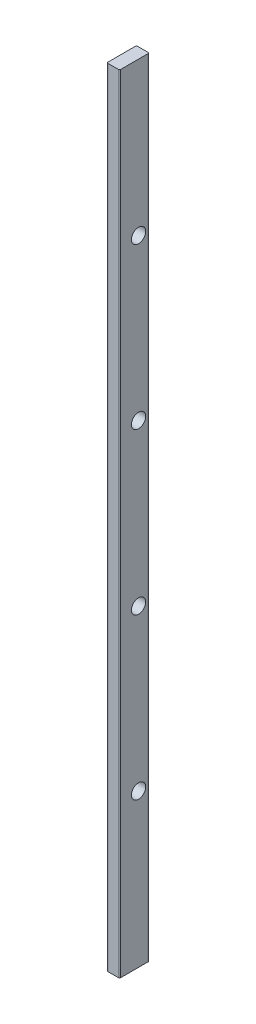
ISO-10303-21;
HEADER;
FILE_DESCRIPTION(('STEP AP214'),'2;1');
FILE_NAME('part.step','',(''),(''),'','','');
FILE_SCHEMA(('AUTOMOTIVE_DESIGN { 1 0 10303 214 1 1 1 1 }'));
ENDSEC;
DATA;
#1=APPLICATION_CONTEXT('core data for automotive mechanical design processes');
#2=APPLICATION_PROTOCOL_DEFINITION('international standard','automotive_design',2000,#1);
#3=PRODUCT_CONTEXT('',#1,'mechanical');
#4=PRODUCT('Part','Part','',(#3));
#5=PRODUCT_RELATED_PRODUCT_CATEGORY('part','',(#4));
#6=PRODUCT_DEFINITION_FORMATION('','',#4);
#7=PRODUCT_DEFINITION_CONTEXT('part definition',#1,'design');
#8=PRODUCT_DEFINITION('design','',#6,#7);
#9=PRODUCT_DEFINITION_SHAPE('','',#8);
#10=(LENGTH_UNIT() NAMED_UNIT(*) SI_UNIT(.MILLI.,.METRE.));
#11=(NAMED_UNIT(*) PLANE_ANGLE_UNIT() SI_UNIT($,.RADIAN.));
#12=(NAMED_UNIT(*) SI_UNIT($,.STERADIAN.) SOLID_ANGLE_UNIT());
#13=UNCERTAINTY_MEASURE_WITH_UNIT(LENGTH_MEASURE(1.E-05),#10,'distance_accuracy_value','');
#14=(GEOMETRIC_REPRESENTATION_CONTEXT(3) GLOBAL_UNCERTAINTY_ASSIGNED_CONTEXT((#13)) GLOBAL_UNIT_ASSIGNED_CONTEXT((#10,
#11,#12)) REPRESENTATION_CONTEXT('',''));
#15=CARTESIAN_POINT('',(0.,0.,0.));
#16=DIRECTION('',(0.,0.,1.));
#17=DIRECTION('',(1.,0.,0.));
#18=AXIS2_PLACEMENT_3D('',#15,#16,#17);
#19=CARTESIAN_POINT('',(19.05,2362.2,44.45));
#20=DIRECTION('',(-1.,0.,0.));
#21=DIRECTION('',(0.,0.,1.));
#22=AXIS2_PLACEMENT_3D('',#19,#20,#21);
#23=PLANE('',#22);
#24=CARTESIAN_POINT('',(19.0500000000006,1903.4125,-12.7));
#25=DIRECTION('',(-1.,0.,0.));
#26=DIRECTION('',(0.,0.,-1.));
#27=AXIS2_PLACEMENT_3D('',#24,#25,#26);
#28=CIRCLE('',#27,21.43125);
#29=CARTESIAN_POINT('',(19.0500000000006,1903.4125,-34.13125));
#30=VERTEX_POINT('',#29);
#31=EDGE_CURVE('E182',#30,#30,#28,.T.);
#32=ORIENTED_EDGE('',*,*,#31,.T.);
#33=EDGE_LOOP('',(#32));
#34=FACE_BOUND('',#33,.T.);
#35=CARTESIAN_POINT('',(19.0500000000013,1422.4,-12.7));
#36=DIRECTION('',(-1.,0.,0.));
#37=DIRECTION('',(0.,0.,-1.));
#38=AXIS2_PLACEMENT_3D('',#35,#36,#37);
#39=CIRCLE('',#38,21.43125);
#40=CARTESIAN_POINT('',(19.0500000000013,1422.4,-34.13125));
#41=VERTEX_POINT('',#40);
#42=EDGE_CURVE('E190',#41,#41,#39,.T.);
#43=ORIENTED_EDGE('',*,*,#42,.T.);
#44=EDGE_LOOP('',(#43));
#45=FACE_BOUND('',#44,.T.);
#46=CARTESIAN_POINT('',(19.05,458.7875,-12.7));
#47=DIRECTION('',(1.,0.,0.));
#48=DIRECTION('',(0.,0.,-1.));
#49=AXIS2_PLACEMENT_3D('',#46,#47,#48);
#50=CIRCLE('',#49,21.43125);
#51=CARTESIAN_POINT('',(19.05,458.7875,8.73125));
#52=VERTEX_POINT('',#51);
#53=EDGE_CURVE('E125',#52,#52,#50,.T.);
#54=ORIENTED_EDGE('',*,*,#53,.F.);
#55=EDGE_LOOP('',(#54));
#56=FACE_BOUND('',#55,.T.);
#57=CARTESIAN_POINT('',(19.05,939.8,-12.7));
#58=DIRECTION('',(1.,0.,0.));
#59=DIRECTION('',(0.,0.,-1.));
#60=AXIS2_PLACEMENT_3D('',#57,#58,#59);
#61=CIRCLE('',#60,21.43125);
#62=CARTESIAN_POINT('',(19.05,939.8,8.73125));
#63=VERTEX_POINT('',#62);
#64=EDGE_CURVE('E181',#63,#63,#61,.T.);
#65=ORIENTED_EDGE('',*,*,#64,.F.);
#66=EDGE_LOOP('',(#65));
#67=FACE_BOUND('',#66,.T.);
#68=DIRECTION('',(0.,0.,-1.));
#69=VECTOR('',#68,1.);
#70=CARTESIAN_POINT('',(19.05,2362.2,44.45));
#71=LINE('',#70,#69);
#72=CARTESIAN_POINT('',(19.05,2362.2,41.275));
#73=VERTEX_POINT('',#72);
#74=CARTESIAN_POINT('',(19.05,2362.2,-41.275));
#75=VERTEX_POINT('',#74);
#76=EDGE_CURVE('E118',#73,#75,#71,.T.);
#77=ORIENTED_EDGE('',*,*,#76,.F.);
#78=DIRECTION('',(0.,-1.,0.));
#79=VECTOR('',#78,1.);
#80=CARTESIAN_POINT('',(19.05,2362.2,41.275));
#81=LINE('',#80,#79);
#82=CARTESIAN_POINT('',(19.05,0.,41.275));
#83=VERTEX_POINT('',#82);
#84=EDGE_CURVE('E103',#73,#83,#81,.T.);
#85=ORIENTED_EDGE('',*,*,#84,.T.);
#86=DIRECTION('',(0.,0.,-1.));
#87=VECTOR('',#86,1.);
#88=CARTESIAN_POINT('',(19.05,0.,44.45));
#89=LINE('',#88,#87);
#90=CARTESIAN_POINT('',(19.05,0.,-41.275));
#91=VERTEX_POINT('',#90);
#92=EDGE_CURVE('E115',#83,#91,#89,.T.);
#93=ORIENTED_EDGE('',*,*,#92,.T.);
#94=DIRECTION('',(0.,-1.,0.));
#95=VECTOR('',#94,1.);
#96=CARTESIAN_POINT('',(19.05,2362.2,-41.275));
#97=LINE('',#96,#95);
#98=EDGE_CURVE('E120',#91,#75,#97,.F.);
#99=ORIENTED_EDGE('',*,*,#98,.T.);
#100=EDGE_LOOP('',(#77,#85,#93,#99));
#101=FACE_BOUND('',#100,.T.);
#102=ADVANCED_FACE('F33',(#34,#45,#56,#67,#101),#23,.F.);
#103=CARTESIAN_POINT('',(-19.05,2362.2,-44.45));
#104=DIRECTION('',(0.,0.,1.));
#105=DIRECTION('',(1.,0.,0.));
#106=AXIS2_PLACEMENT_3D('',#103,#104,#105);
#107=PLANE('',#106);
#108=DIRECTION('',(-1.,0.,0.));
#109=VECTOR('',#108,1.);
#110=CARTESIAN_POINT('',(-19.05,0.,-44.45));
#111=LINE('',#110,#109);
#112=CARTESIAN_POINT('',(15.875,0.,-44.45));
#113=VERTEX_POINT('',#112);
#114=CARTESIAN_POINT('',(-15.875,0.,-44.45));
#115=VERTEX_POINT('',#114);
#116=EDGE_CURVE('E124',#113,#115,#111,.T.);
#117=ORIENTED_EDGE('',*,*,#116,.T.);
#118=DIRECTION('',(0.,-1.,0.));
#119=VECTOR('',#118,1.);
#120=CARTESIAN_POINT('',(-15.875,2362.2,-44.45));
#121=LINE('',#120,#119);
#122=CARTESIAN_POINT('',(-15.875,2362.2,-44.45));
#123=VERTEX_POINT('',#122);
#124=EDGE_CURVE('E11',#115,#123,#121,.F.);
#125=ORIENTED_EDGE('',*,*,#124,.T.);
#126=DIRECTION('',(-1.,0.,0.));
#127=VECTOR('',#126,1.);
#128=CARTESIAN_POINT('',(-19.05,2362.2,-44.45));
#129=LINE('',#128,#127);
#130=CARTESIAN_POINT('',(15.875,2362.2,-44.45));
#131=VERTEX_POINT('',#130);
#132=EDGE_CURVE('E164',#131,#123,#129,.T.);
#133=ORIENTED_EDGE('',*,*,#132,.F.);
#134=DIRECTION('',(0.,-1.,0.));
#135=VECTOR('',#134,1.);
#136=CARTESIAN_POINT('',(15.875,2362.2,-44.45));
#137=LINE('',#136,#135);
#138=EDGE_CURVE('E41',#131,#113,#137,.T.);
#139=ORIENTED_EDGE('',*,*,#138,.T.);
#140=EDGE_LOOP('',(#117,#125,#133,#139));
#141=FACE_BOUND('',#140,.T.);
#142=ADVANCED_FACE('F162',(#141),#107,.F.);
#143=CARTESIAN_POINT('',(-19.05,2362.2,44.45));
#144=DIRECTION('',(1.,0.,0.));
#145=DIRECTION('',(0.,0.,-1.));
#146=AXIS2_PLACEMENT_3D('',#143,#144,#145);
#147=PLANE('',#146);
#148=CARTESIAN_POINT('',(-19.050000000001,1903.4125,-12.7));
#149=DIRECTION('',(-1.,0.,0.));
#150=DIRECTION('',(0.,0.,-1.));
#151=AXIS2_PLACEMENT_3D('',#148,#149,#150);
#152=CIRCLE('',#151,21.43125);
#153=CARTESIAN_POINT('',(-19.050000000001,1903.4125,-34.13125));
#154=VERTEX_POINT('',#153);
#155=EDGE_CURVE('E193',#154,#154,#152,.T.);
#156=ORIENTED_EDGE('',*,*,#155,.F.);
#157=EDGE_LOOP('',(#156));
#158=FACE_BOUND('',#157,.T.);
#159=CARTESIAN_POINT('',(-19.0500000000003,1422.4,-12.7));
#160=DIRECTION('',(-1.,0.,0.));
#161=DIRECTION('',(0.,0.,-1.));
#162=AXIS2_PLACEMENT_3D('',#159,#160,#161);
#163=CIRCLE('',#162,21.43125);
#164=CARTESIAN_POINT('',(-19.0500000000003,1422.4,-34.13125));
#165=VERTEX_POINT('',#164);
#166=EDGE_CURVE('E187',#165,#165,#163,.T.);
#167=ORIENTED_EDGE('',*,*,#166,.F.);
#168=EDGE_LOOP('',(#167));
#169=FACE_BOUND('',#168,.T.);
#170=CARTESIAN_POINT('',(-19.05,458.7875,-12.7));
#171=DIRECTION('',(1.,0.,0.));
#172=DIRECTION('',(0.,0.,-1.));
#173=AXIS2_PLACEMENT_3D('',#170,#171,#172);
#174=CIRCLE('',#173,21.43125);
#175=CARTESIAN_POINT('',(-19.05,458.7875,8.73125));
#176=VERTEX_POINT('',#175);
#177=EDGE_CURVE('E131',#176,#176,#174,.T.);
#178=ORIENTED_EDGE('',*,*,#177,.T.);
#179=EDGE_LOOP('',(#178));
#180=FACE_BOUND('',#179,.T.);
#181=CARTESIAN_POINT('',(-19.05,939.8,-12.7));
#182=DIRECTION('',(1.,0.,0.));
#183=DIRECTION('',(0.,0.,-1.));
#184=AXIS2_PLACEMENT_3D('',#181,#182,#183);
#185=CIRCLE('',#184,21.43125);
#186=CARTESIAN_POINT('',(-19.05,939.8,8.73125));
#187=VERTEX_POINT('',#186);
#188=EDGE_CURVE('E178',#187,#187,#185,.T.);
#189=ORIENTED_EDGE('',*,*,#188,.T.);
#190=EDGE_LOOP('',(#189));
#191=FACE_BOUND('',#190,.T.);
#192=DIRECTION('',(0.,0.,1.));
#193=VECTOR('',#192,1.);
#194=CARTESIAN_POINT('',(-19.05,0.,44.45));
#195=LINE('',#194,#193);
#196=CARTESIAN_POINT('',(-19.05,0.,-41.275));
#197=VERTEX_POINT('',#196);
#198=CARTESIAN_POINT('',(-19.05,0.,41.275));
#199=VERTEX_POINT('',#198);
#200=EDGE_CURVE('E128',#197,#199,#195,.T.);
#201=ORIENTED_EDGE('',*,*,#200,.T.);
#202=DIRECTION('',(0.,-1.,0.));
#203=VECTOR('',#202,1.);
#204=CARTESIAN_POINT('',(-19.05,2362.2,41.275));
#205=LINE('',#204,#203);
#206=CARTESIAN_POINT('',(-19.05,2362.2,41.275));
#207=VERTEX_POINT('',#206);
#208=EDGE_CURVE('E48',#199,#207,#205,.F.);
#209=ORIENTED_EDGE('',*,*,#208,.T.);
#210=DIRECTION('',(0.,0.,1.));
#211=VECTOR('',#210,1.);
#212=CARTESIAN_POINT('',(-19.05,2362.2,44.45));
#213=LINE('',#212,#211);
#214=CARTESIAN_POINT('',(-19.05,2362.2,-41.275));
#215=VERTEX_POINT('',#214);
#216=EDGE_CURVE('E172',#215,#207,#213,.T.);
#217=ORIENTED_EDGE('',*,*,#216,.F.);
#218=DIRECTION('',(0.,-1.,0.));
#219=VECTOR('',#218,1.);
#220=CARTESIAN_POINT('',(-19.05,2362.2,-41.275));
#221=LINE('',#220,#219);
#222=EDGE_CURVE('E155',#215,#197,#221,.T.);
#223=ORIENTED_EDGE('',*,*,#222,.T.);
#224=EDGE_LOOP('',(#201,#209,#217,#223));
#225=FACE_BOUND('',#224,.T.);
#226=ADVANCED_FACE('F171',(#158,#169,#180,#191,#225),#147,.F.);
#227=CARTESIAN_POINT('',(-19.05,2362.2,44.45));
#228=DIRECTION('',(0.,0.,-1.));
#229=DIRECTION('',(-1.,0.,0.));
#230=AXIS2_PLACEMENT_3D('',#227,#228,#229);
#231=PLANE('',#230);
#232=DIRECTION('',(1.,0.,0.));
#233=VECTOR('',#232,1.);
#234=CARTESIAN_POINT('',(-19.05,0.,44.45));
#235=LINE('',#234,#233);
#236=CARTESIAN_POINT('',(-15.875,0.,44.45));
#237=VERTEX_POINT('',#236);
#238=CARTESIAN_POINT('',(15.875,0.,44.45));
#239=VERTEX_POINT('',#238);
#240=EDGE_CURVE('E138',#237,#239,#235,.T.);
#241=ORIENTED_EDGE('',*,*,#240,.T.);
#242=DIRECTION('',(0.,-1.,0.));
#243=VECTOR('',#242,1.);
#244=CARTESIAN_POINT('',(15.875,2362.2,44.45));
#245=LINE('',#244,#243);
#246=CARTESIAN_POINT('',(15.875,2362.2,44.45));
#247=VERTEX_POINT('',#246);
#248=EDGE_CURVE('E104',#239,#247,#245,.F.);
#249=ORIENTED_EDGE('',*,*,#248,.T.);
#250=DIRECTION('',(1.,0.,0.));
#251=VECTOR('',#250,1.);
#252=CARTESIAN_POINT('',(-19.05,2362.2,44.45));
#253=LINE('',#252,#251);
#254=CARTESIAN_POINT('',(-15.875,2362.2,44.45));
#255=VERTEX_POINT('',#254);
#256=EDGE_CURVE('E134',#255,#247,#253,.T.);
#257=ORIENTED_EDGE('',*,*,#256,.F.);
#258=DIRECTION('',(0.,-1.,0.));
#259=VECTOR('',#258,1.);
#260=CARTESIAN_POINT('',(-15.875,2362.2,44.45));
#261=LINE('',#260,#259);
#262=EDGE_CURVE('E109',#255,#237,#261,.T.);
#263=ORIENTED_EDGE('',*,*,#262,.T.);
#264=EDGE_LOOP('',(#241,#249,#257,#263));
#265=FACE_BOUND('',#264,.T.);
#266=ADVANCED_FACE('F210',(#265),#231,.F.);
#267=CARTESIAN_POINT('',(0.,2362.2,0.));
#268=DIRECTION('',(0.,-1.,0.));
#269=DIRECTION('',(0.,0.,-1.));
#270=AXIS2_PLACEMENT_3D('',#267,#268,#269);
#271=PLANE('',#270);
#272=ORIENTED_EDGE('',*,*,#256,.T.);
#273=CARTESIAN_POINT('',(15.875,2362.2,41.275));
#274=DIRECTION('',(0.,-1.,0.));
#275=DIRECTION('',(0.,0.,-1.));
#276=AXIS2_PLACEMENT_3D('',#273,#274,#275);
#277=CIRCLE('',#276,3.175);
#278=EDGE_CURVE('E153',#247,#73,#277,.F.);
#279=ORIENTED_EDGE('',*,*,#278,.T.);
#280=ORIENTED_EDGE('',*,*,#76,.T.);
#281=CARTESIAN_POINT('',(15.875,2362.2,-41.275));
#282=DIRECTION('',(0.,-1.,0.));
#283=DIRECTION('',(0.,0.,-1.));
#284=AXIS2_PLACEMENT_3D('',#281,#282,#283);
#285=CIRCLE('',#284,3.175);
#286=EDGE_CURVE('E148',#75,#131,#285,.F.);
#287=ORIENTED_EDGE('',*,*,#286,.T.);
#288=ORIENTED_EDGE('',*,*,#132,.T.);
#289=CARTESIAN_POINT('',(-15.875,2362.2,-41.275));
#290=DIRECTION('',(0.,-1.,0.));
#291=DIRECTION('',(0.,0.,-1.));
#292=AXIS2_PLACEMENT_3D('',#289,#290,#291);
#293=CIRCLE('',#292,3.175);
#294=EDGE_CURVE('E55',#123,#215,#293,.F.);
#295=ORIENTED_EDGE('',*,*,#294,.T.);
#296=ORIENTED_EDGE('',*,*,#216,.T.);
#297=CARTESIAN_POINT('',(-15.875,2362.2,41.275));
#298=DIRECTION('',(0.,-1.,0.));
#299=DIRECTION('',(0.,0.,-1.));
#300=AXIS2_PLACEMENT_3D('',#297,#298,#299);
#301=CIRCLE('',#300,3.175);
#302=EDGE_CURVE('E151',#207,#255,#301,.F.);
#303=ORIENTED_EDGE('',*,*,#302,.T.);
#304=EDGE_LOOP('',(#272,#279,#280,#287,#288,#295,#296,#303));
#305=FACE_BOUND('',#304,.T.);
#306=ADVANCED_FACE('F229',(#305),#271,.F.);
#307=CARTESIAN_POINT('',(0.,0.,0.));
#308=DIRECTION('',(0.,-1.,0.));
#309=DIRECTION('',(0.,0.,-1.));
#310=AXIS2_PLACEMENT_3D('',#307,#308,#309);
#311=PLANE('',#310);
#312=ORIENTED_EDGE('',*,*,#92,.F.);
#313=CARTESIAN_POINT('',(15.875,0.,41.275));
#314=DIRECTION('',(0.,-1.,0.));
#315=DIRECTION('',(0.,0.,-1.));
#316=AXIS2_PLACEMENT_3D('',#313,#314,#315);
#317=CIRCLE('',#316,3.175);
#318=EDGE_CURVE('E99',#83,#239,#317,.T.);
#319=ORIENTED_EDGE('',*,*,#318,.T.);
#320=ORIENTED_EDGE('',*,*,#240,.F.);
#321=CARTESIAN_POINT('',(-15.875,0.,41.275));
#322=DIRECTION('',(0.,-1.,0.));
#323=DIRECTION('',(0.,0.,-1.));
#324=AXIS2_PLACEMENT_3D('',#321,#322,#323);
#325=CIRCLE('',#324,3.175);
#326=EDGE_CURVE('E110',#237,#199,#325,.T.);
#327=ORIENTED_EDGE('',*,*,#326,.T.);
#328=ORIENTED_EDGE('',*,*,#200,.F.);
#329=CARTESIAN_POINT('',(-15.875,0.,-41.275));
#330=DIRECTION('',(0.,-1.,0.));
#331=DIRECTION('',(0.,0.,-1.));
#332=AXIS2_PLACEMENT_3D('',#329,#330,#331);
#333=CIRCLE('',#332,3.175);
#334=EDGE_CURVE('E142',#197,#115,#333,.T.);
#335=ORIENTED_EDGE('',*,*,#334,.T.);
#336=ORIENTED_EDGE('',*,*,#116,.F.);
#337=CARTESIAN_POINT('',(15.875,0.,-41.275));
#338=DIRECTION('',(0.,-1.,0.));
#339=DIRECTION('',(0.,0.,-1.));
#340=AXIS2_PLACEMENT_3D('',#337,#338,#339);
#341=CIRCLE('',#340,3.175);
#342=EDGE_CURVE('E119',#113,#91,#341,.T.);
#343=ORIENTED_EDGE('',*,*,#342,.T.);
#344=EDGE_LOOP('',(#312,#319,#320,#327,#328,#335,#336,#343));
#345=FACE_BOUND('',#344,.T.);
#346=ADVANCED_FACE('F122',(#345),#311,.T.);
#347=CARTESIAN_POINT('',(19.05,939.8,-12.7));
#348=DIRECTION('',(-1.,0.,0.));
#349=DIRECTION('',(0.,0.,1.));
#350=AXIS2_PLACEMENT_3D('',#347,#348,#349);
#351=CYLINDRICAL_SURFACE('',#350,21.43125);
#352=CARTESIAN_POINT('',(19.05,939.8,8.73125));
#353=CARTESIAN_POINT('',(18.653125,939.8,8.73125));
#354=CARTESIAN_POINT('',(18.25625,939.8,8.73125));
#355=CARTESIAN_POINT('',(17.4625,939.8,8.73125));
#356=CARTESIAN_POINT('',(17.065625,939.8,8.73125));
#357=CARTESIAN_POINT('',(16.271875,939.8,8.73125));
#358=CARTESIAN_POINT('',(15.875,939.8,8.73125));
#359=CARTESIAN_POINT('',(15.08125,939.8,8.73125));
#360=CARTESIAN_POINT('',(14.684375,939.8,8.73125));
#361=CARTESIAN_POINT('',(13.890625,939.8,8.73125));
#362=CARTESIAN_POINT('',(13.49375,939.8,8.73125));
#363=CARTESIAN_POINT('',(12.7,939.8,8.73125));
#364=CARTESIAN_POINT('',(12.303125,939.8,8.73125));
#365=CARTESIAN_POINT('',(11.509375,939.8,8.73125));
#366=CARTESIAN_POINT('',(11.1125,939.8,8.73125));
#367=CARTESIAN_POINT('',(10.31875,939.8,8.73125));
#368=CARTESIAN_POINT('',(9.921875,939.8,8.73125));
#369=CARTESIAN_POINT('',(9.128125,939.8,8.73125));
#370=CARTESIAN_POINT('',(8.73125,939.8,8.73125));
#371=CARTESIAN_POINT('',(7.9375,939.8,8.73125));
#372=CARTESIAN_POINT('',(7.540625,939.8,8.73125));
#373=CARTESIAN_POINT('',(6.746875,939.8,8.73125));
#374=CARTESIAN_POINT('',(6.35,939.8,8.73125));
#375=CARTESIAN_POINT('',(5.55625,939.8,8.73125));
#376=CARTESIAN_POINT('',(5.159375,939.8,8.73125));
#377=CARTESIAN_POINT('',(4.365625,939.8,8.73125));
#378=CARTESIAN_POINT('',(3.96875,939.8,8.73125));
#379=CARTESIAN_POINT('',(3.175,939.8,8.73125));
#380=CARTESIAN_POINT('',(2.778125,939.8,8.73125));
#381=CARTESIAN_POINT('',(1.984375,939.8,8.73125));
#382=CARTESIAN_POINT('',(1.5875,939.8,8.73125));
#383=CARTESIAN_POINT('',(0.793750000000004,939.8,8.73125));
#384=CARTESIAN_POINT('',(0.396875000000004,939.8,8.73125));
#385=CARTESIAN_POINT('',(-0.396874999999997,939.8,8.73125));
#386=CARTESIAN_POINT('',(-0.793749999999997,939.8,8.73125));
#387=CARTESIAN_POINT('',(-1.5875,939.8,8.73125));
#388=CARTESIAN_POINT('',(-1.984375,939.8,8.73125));
#389=CARTESIAN_POINT('',(-2.778125,939.8,8.73125));
#390=CARTESIAN_POINT('',(-3.175,939.8,8.73125));
#391=CARTESIAN_POINT('',(-3.96875,939.8,8.73125));
#392=CARTESIAN_POINT('',(-4.365625,939.8,8.73125));
#393=CARTESIAN_POINT('',(-5.159375,939.8,8.73125));
#394=CARTESIAN_POINT('',(-5.55625,939.8,8.73125));
#395=CARTESIAN_POINT('',(-6.35,939.8,8.73125));
#396=CARTESIAN_POINT('',(-6.746875,939.8,8.73125));
#397=CARTESIAN_POINT('',(-7.540625,939.8,8.73125));
#398=CARTESIAN_POINT('',(-7.9375,939.8,8.73125));
#399=CARTESIAN_POINT('',(-8.73125,939.8,8.73125));
#400=CARTESIAN_POINT('',(-9.128125,939.8,8.73125));
#401=CARTESIAN_POINT('',(-9.921875,939.8,8.73125));
#402=CARTESIAN_POINT('',(-10.31875,939.8,8.73125));
#403=CARTESIAN_POINT('',(-11.1125,939.8,8.73125));
#404=CARTESIAN_POINT('',(-11.509375,939.8,8.73125));
#405=CARTESIAN_POINT('',(-12.303125,939.8,8.73125));
#406=CARTESIAN_POINT('',(-12.7,939.8,8.73125));
#407=CARTESIAN_POINT('',(-13.49375,939.8,8.73125));
#408=CARTESIAN_POINT('',(-13.890625,939.8,8.73125));
#409=CARTESIAN_POINT('',(-14.684375,939.8,8.73125));
#410=CARTESIAN_POINT('',(-15.08125,939.8,8.73125));
#411=CARTESIAN_POINT('',(-15.875,939.8,8.73125));
#412=CARTESIAN_POINT('',(-16.271875,939.8,8.73125));
#413=CARTESIAN_POINT('',(-17.065625,939.8,8.73125));
#414=CARTESIAN_POINT('',(-17.4625,939.8,8.73125));
#415=CARTESIAN_POINT('',(-18.25625,939.8,8.73125));
#416=CARTESIAN_POINT('',(-18.653125,939.8,8.73125));
#417=CARTESIAN_POINT('',(-19.05,939.8,8.73125));
#418=B_SPLINE_CURVE_WITH_KNOTS('',3,(#352,#353,#354,#355,#356,#357,#358,#359,#360,#361,#362,
#363,#364,#365,#366,#367,#368,#369,#370,#371,#372,#373,#374,#375,#376,#377,#378,#379,#380,#381,
#382,#383,#384,#385,#386,#387,#388,#389,#390,#391,#392,#393,#394,#395,#396,#397,#398,#399,#400,
#401,#402,#403,#404,#405,#406,#407,#408,#409,#410,#411,#412,#413,#414,#415,#416,#417),
.UNSPECIFIED.,.F.,.F.,(4,2,2,2,2,2,2,2,2,2,2,2,2,2,2,2,2,2,2,2,2,2,2,2,2,2,2,2,2,2,2,2,4),(0.,
1.190625,2.38125,3.571875,4.7625,5.953125,7.14375,8.334375,9.525,10.715625,11.90625,13.096875,
14.2875,15.478125,16.66875,17.859375,19.05,20.240625,21.43125,22.621875,23.8125,25.003125,
26.19375,27.384375,28.575,29.765625,30.95625,32.146875,33.3375,34.528125,35.71875,36.909375,
38.1),.UNSPECIFIED.);
#419=EDGE_CURVE('BSEAM218',#63,#187,#418,.T.);
#420=ORIENTED_EDGE('',*,*,#64,.T.);
#421=ORIENTED_EDGE('',*,*,#188,.F.);
#422=ORIENTED_EDGE('',*,*,#419,.T.);
#423=ORIENTED_EDGE('',*,*,#419,.F.);
#424=EDGE_LOOP('',(#420,#422,#421,#423));
#425=FACE_BOUND('',#424,.T.);
#426=ADVANCED_FACE('F218',(#425),#351,.F.);
#427=CARTESIAN_POINT('',(19.05,458.7875,-12.7));
#428=DIRECTION('',(-1.,0.,0.));
#429=DIRECTION('',(0.,0.,1.));
#430=AXIS2_PLACEMENT_3D('',#427,#428,#429);
#431=CYLINDRICAL_SURFACE('',#430,21.43125);
#432=CARTESIAN_POINT('',(19.05,458.7875,8.73125));
#433=CARTESIAN_POINT('',(18.653125,458.7875,8.73125));
#434=CARTESIAN_POINT('',(18.25625,458.7875,8.73125));
#435=CARTESIAN_POINT('',(17.4625,458.7875,8.73125));
#436=CARTESIAN_POINT('',(17.065625,458.7875,8.73125));
#437=CARTESIAN_POINT('',(16.271875,458.7875,8.73125));
#438=CARTESIAN_POINT('',(15.875,458.7875,8.73125));
#439=CARTESIAN_POINT('',(15.08125,458.7875,8.73125));
#440=CARTESIAN_POINT('',(14.684375,458.7875,8.73125));
#441=CARTESIAN_POINT('',(13.890625,458.7875,8.73125));
#442=CARTESIAN_POINT('',(13.49375,458.7875,8.73125));
#443=CARTESIAN_POINT('',(12.7,458.7875,8.73125));
#444=CARTESIAN_POINT('',(12.303125,458.7875,8.73125));
#445=CARTESIAN_POINT('',(11.509375,458.7875,8.73125));
#446=CARTESIAN_POINT('',(11.1125,458.7875,8.73125));
#447=CARTESIAN_POINT('',(10.31875,458.7875,8.73125));
#448=CARTESIAN_POINT('',(9.921875,458.7875,8.73125));
#449=CARTESIAN_POINT('',(9.128125,458.7875,8.73125));
#450=CARTESIAN_POINT('',(8.73125,458.7875,8.73125));
#451=CARTESIAN_POINT('',(7.9375,458.7875,8.73125));
#452=CARTESIAN_POINT('',(7.540625,458.7875,8.73125));
#453=CARTESIAN_POINT('',(6.746875,458.7875,8.73125));
#454=CARTESIAN_POINT('',(6.35,458.7875,8.73125));
#455=CARTESIAN_POINT('',(5.55625,458.7875,8.73125));
#456=CARTESIAN_POINT('',(5.159375,458.7875,8.73125));
#457=CARTESIAN_POINT('',(4.365625,458.7875,8.73125));
#458=CARTESIAN_POINT('',(3.96875,458.7875,8.73125));
#459=CARTESIAN_POINT('',(3.175,458.7875,8.73125));
#460=CARTESIAN_POINT('',(2.778125,458.7875,8.73125));
#461=CARTESIAN_POINT('',(1.984375,458.7875,8.73125));
#462=CARTESIAN_POINT('',(1.5875,458.7875,8.73125));
#463=CARTESIAN_POINT('',(0.793750000000004,458.7875,8.73125));
#464=CARTESIAN_POINT('',(0.396875000000004,458.7875,8.73125));
#465=CARTESIAN_POINT('',(-0.396874999999997,458.7875,8.73125));
#466=CARTESIAN_POINT('',(-0.793749999999997,458.7875,8.73125));
#467=CARTESIAN_POINT('',(-1.5875,458.7875,8.73125));
#468=CARTESIAN_POINT('',(-1.984375,458.7875,8.73125));
#469=CARTESIAN_POINT('',(-2.778125,458.7875,8.73125));
#470=CARTESIAN_POINT('',(-3.175,458.7875,8.73125));
#471=CARTESIAN_POINT('',(-3.96875,458.7875,8.73125));
#472=CARTESIAN_POINT('',(-4.365625,458.7875,8.73125));
#473=CARTESIAN_POINT('',(-5.159375,458.7875,8.73125));
#474=CARTESIAN_POINT('',(-5.55625,458.7875,8.73125));
#475=CARTESIAN_POINT('',(-6.35,458.7875,8.73125));
#476=CARTESIAN_POINT('',(-6.746875,458.7875,8.73125));
#477=CARTESIAN_POINT('',(-7.540625,458.7875,8.73125));
#478=CARTESIAN_POINT('',(-7.9375,458.7875,8.73125));
#479=CARTESIAN_POINT('',(-8.73125,458.7875,8.73125));
#480=CARTESIAN_POINT('',(-9.128125,458.7875,8.73125));
#481=CARTESIAN_POINT('',(-9.921875,458.7875,8.73125));
#482=CARTESIAN_POINT('',(-10.31875,458.7875,8.73125));
#483=CARTESIAN_POINT('',(-11.1125,458.7875,8.73125));
#484=CARTESIAN_POINT('',(-11.509375,458.7875,8.73125));
#485=CARTESIAN_POINT('',(-12.303125,458.7875,8.73125));
#486=CARTESIAN_POINT('',(-12.7,458.7875,8.73125));
#487=CARTESIAN_POINT('',(-13.49375,458.7875,8.73125));
#488=CARTESIAN_POINT('',(-13.890625,458.7875,8.73125));
#489=CARTESIAN_POINT('',(-14.684375,458.7875,8.73125));
#490=CARTESIAN_POINT('',(-15.08125,458.7875,8.73125));
#491=CARTESIAN_POINT('',(-15.875,458.7875,8.73125));
#492=CARTESIAN_POINT('',(-16.271875,458.7875,8.73125));
#493=CARTESIAN_POINT('',(-17.065625,458.7875,8.73125));
#494=CARTESIAN_POINT('',(-17.4625,458.7875,8.73125));
#495=CARTESIAN_POINT('',(-18.25625,458.7875,8.73125));
#496=CARTESIAN_POINT('',(-18.653125,458.7875,8.73125));
#497=CARTESIAN_POINT('',(-19.05,458.7875,8.73125));
#498=B_SPLINE_CURVE_WITH_KNOTS('',3,(#432,#433,#434,#435,#436,#437,#438,#439,#440,#441,#442,
#443,#444,#445,#446,#447,#448,#449,#450,#451,#452,#453,#454,#455,#456,#457,#458,#459,#460,#461,
#462,#463,#464,#465,#466,#467,#468,#469,#470,#471,#472,#473,#474,#475,#476,#477,#478,#479,#480,
#481,#482,#483,#484,#485,#486,#487,#488,#489,#490,#491,#492,#493,#494,#495,#496,#497),
.UNSPECIFIED.,.F.,.F.,(4,2,2,2,2,2,2,2,2,2,2,2,2,2,2,2,2,2,2,2,2,2,2,2,2,2,2,2,2,2,2,2,4),(0.,
1.190625,2.38125,3.571875,4.7625,5.953125,7.14375,8.334375,9.525,10.715625,11.90625,13.096875,
14.2875,15.478125,16.66875,17.859375,19.05,20.240625,21.43125,22.621875,23.8125,25.003125,
26.19375,27.384375,28.575,29.765625,30.95625,32.146875,33.3375,34.528125,35.71875,36.909375,
38.1),.UNSPECIFIED.);
#499=EDGE_CURVE('BSEAM220',#52,#176,#498,.T.);
#500=ORIENTED_EDGE('',*,*,#53,.T.);
#501=ORIENTED_EDGE('',*,*,#177,.F.);
#502=ORIENTED_EDGE('',*,*,#499,.T.);
#503=ORIENTED_EDGE('',*,*,#499,.F.);
#504=EDGE_LOOP('',(#500,#502,#501,#503));
#505=FACE_BOUND('',#504,.T.);
#506=ADVANCED_FACE('F220',(#505),#431,.F.);
#507=CARTESIAN_POINT('',(15.875,2362.2,41.275));
#508=DIRECTION('',(0.,-1.,0.));
#509=DIRECTION('',(0.,0.,-1.));
#510=AXIS2_PLACEMENT_3D('',#507,#508,#509);
#511=CYLINDRICAL_SURFACE('',#510,3.175);
#512=ORIENTED_EDGE('',*,*,#278,.F.);
#513=ORIENTED_EDGE('',*,*,#248,.F.);
#514=ORIENTED_EDGE('',*,*,#318,.F.);
#515=ORIENTED_EDGE('',*,*,#84,.F.);
#516=EDGE_LOOP('',(#512,#513,#514,#515));
#517=FACE_BOUND('',#516,.T.);
#518=ADVANCED_FACE('F102',(#517),#511,.T.);
#519=CARTESIAN_POINT('',(-15.875,2362.2,41.275));
#520=DIRECTION('',(0.,-1.,0.));
#521=DIRECTION('',(0.,0.,-1.));
#522=AXIS2_PLACEMENT_3D('',#519,#520,#521);
#523=CYLINDRICAL_SURFACE('',#522,3.175);
#524=ORIENTED_EDGE('',*,*,#302,.F.);
#525=ORIENTED_EDGE('',*,*,#208,.F.);
#526=ORIENTED_EDGE('',*,*,#326,.F.);
#527=ORIENTED_EDGE('',*,*,#262,.F.);
#528=EDGE_LOOP('',(#524,#525,#526,#527));
#529=FACE_BOUND('',#528,.T.);
#530=ADVANCED_FACE('F241',(#529),#523,.T.);
#531=CARTESIAN_POINT('',(-15.875,2362.2,-41.275));
#532=DIRECTION('',(0.,-1.,0.));
#533=DIRECTION('',(0.,0.,-1.));
#534=AXIS2_PLACEMENT_3D('',#531,#532,#533);
#535=CYLINDRICAL_SURFACE('',#534,3.175);
#536=ORIENTED_EDGE('',*,*,#294,.F.);
#537=ORIENTED_EDGE('',*,*,#124,.F.);
#538=ORIENTED_EDGE('',*,*,#334,.F.);
#539=ORIENTED_EDGE('',*,*,#222,.F.);
#540=EDGE_LOOP('',(#536,#537,#538,#539));
#541=FACE_BOUND('',#540,.T.);
#542=ADVANCED_FACE('F170',(#541),#535,.T.);
#543=CARTESIAN_POINT('',(15.875,2362.2,-41.275));
#544=DIRECTION('',(0.,-1.,0.));
#545=DIRECTION('',(0.,0.,-1.));
#546=AXIS2_PLACEMENT_3D('',#543,#544,#545);
#547=CYLINDRICAL_SURFACE('',#546,3.175);
#548=ORIENTED_EDGE('',*,*,#286,.F.);
#549=ORIENTED_EDGE('',*,*,#98,.F.);
#550=ORIENTED_EDGE('',*,*,#342,.F.);
#551=ORIENTED_EDGE('',*,*,#138,.F.);
#552=EDGE_LOOP('',(#548,#549,#550,#551));
#553=FACE_BOUND('',#552,.T.);
#554=ADVANCED_FACE('F35',(#553),#547,.T.);
#555=CARTESIAN_POINT('',(19.0500000000013,1422.4,-12.7));
#556=DIRECTION('',(-1.,0.,0.));
#557=DIRECTION('',(0.,-1.,0.));
#558=AXIS2_PLACEMENT_3D('',#555,#556,#557);
#559=CYLINDRICAL_SURFACE('',#558,21.43125);
#560=ORIENTED_EDGE('',*,*,#42,.F.);
#561=EDGE_LOOP('',(#560));
#562=FACE_BOUND('',#561,.T.);
#563=ORIENTED_EDGE('',*,*,#166,.T.);
#564=EDGE_LOOP('',(#563));
#565=FACE_BOUND('',#564,.T.);
#566=ADVANCED_FACE('F204',(#562,#565),#559,.F.);
#567=CARTESIAN_POINT('',(19.0500000000006,1903.4125,-12.7));
#568=DIRECTION('',(-1.,0.,0.));
#569=DIRECTION('',(0.,-1.,0.));
#570=AXIS2_PLACEMENT_3D('',#567,#568,#569);
#571=CYLINDRICAL_SURFACE('',#570,21.43125);
#572=ORIENTED_EDGE('',*,*,#31,.F.);
#573=EDGE_LOOP('',(#572));
#574=FACE_BOUND('',#573,.T.);
#575=ORIENTED_EDGE('',*,*,#155,.T.);
#576=EDGE_LOOP('',(#575));
#577=FACE_BOUND('',#576,.T.);
#578=ADVANCED_FACE('F201',(#574,#577),#571,.F.);
#579=CLOSED_SHELL('',(#102,#142,#226,#266,#306,#346,#426,#506,#518,#530,#542,#554,#566,#578));
#580=MANIFOLD_SOLID_BREP('B2',#579);
#581=ADVANCED_BREP_SHAPE_REPRESENTATION('',(#18,#580),#14);
#582=SHAPE_DEFINITION_REPRESENTATION(#9,#581);
ENDSEC;
END-ISO-10303-21;
